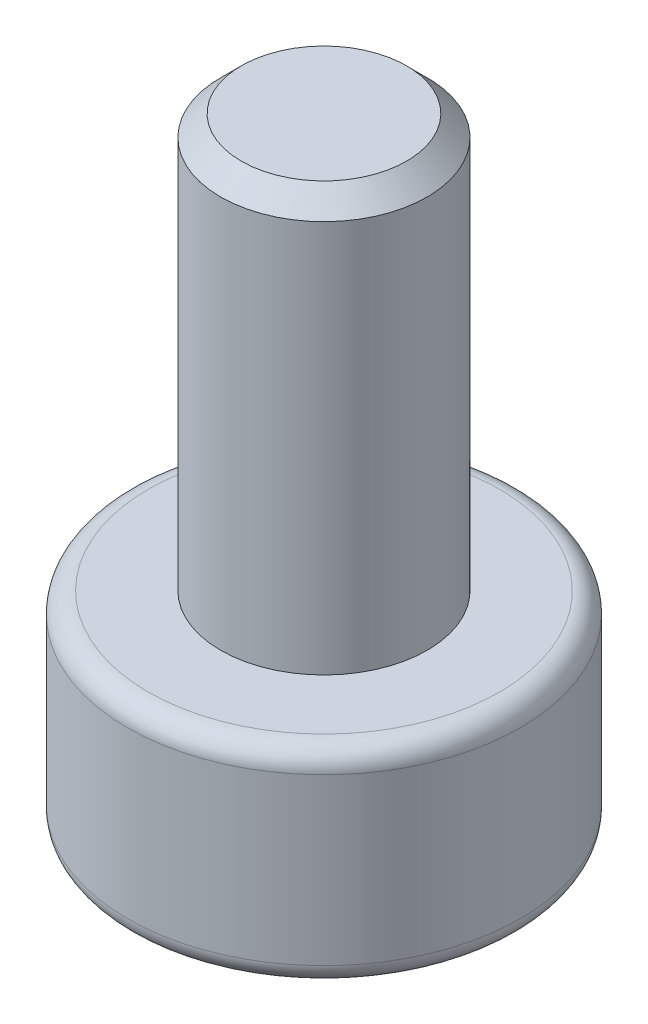
ISO-10303-21;
HEADER;
FILE_DESCRIPTION(('STEP AP214'),'2;1');
FILE_NAME('part.step','',(''),(''),'','','');
FILE_SCHEMA(('AUTOMOTIVE_DESIGN { 1 0 10303 214 1 1 1 1 }'));
ENDSEC;
DATA;
#1=APPLICATION_CONTEXT('core data for automotive mechanical design processes');
#2=APPLICATION_PROTOCOL_DEFINITION('international standard','automotive_design',2000,#1);
#3=PRODUCT_CONTEXT('',#1,'mechanical');
#4=PRODUCT('Part','Part','',(#3));
#5=PRODUCT_RELATED_PRODUCT_CATEGORY('part','',(#4));
#6=PRODUCT_DEFINITION_FORMATION('','',#4);
#7=PRODUCT_DEFINITION_CONTEXT('part definition',#1,'design');
#8=PRODUCT_DEFINITION('design','',#6,#7);
#9=PRODUCT_DEFINITION_SHAPE('','',#8);
#10=(LENGTH_UNIT() NAMED_UNIT(*) SI_UNIT(.MILLI.,.METRE.));
#11=(NAMED_UNIT(*) PLANE_ANGLE_UNIT() SI_UNIT($,.RADIAN.));
#12=(NAMED_UNIT(*) SI_UNIT($,.STERADIAN.) SOLID_ANGLE_UNIT());
#13=UNCERTAINTY_MEASURE_WITH_UNIT(LENGTH_MEASURE(1.E-05),#10,'distance_accuracy_value','');
#14=(GEOMETRIC_REPRESENTATION_CONTEXT(3) GLOBAL_UNCERTAINTY_ASSIGNED_CONTEXT((#13)) GLOBAL_UNIT_ASSIGNED_CONTEXT((#10,
#11,#12)) REPRESENTATION_CONTEXT('',''));
#15=CARTESIAN_POINT('',(0.,0.,0.));
#16=DIRECTION('',(0.,0.,1.));
#17=DIRECTION('',(1.,0.,0.));
#18=AXIS2_PLACEMENT_3D('',#15,#16,#17);
#19=CARTESIAN_POINT('',(0.,3.,0.));
#20=DIRECTION('',(0.,-1.,0.));
#21=DIRECTION('',(0.,0.,-1.));
#22=AXIS2_PLACEMENT_3D('',#19,#20,#21);
#23=CYLINDRICAL_SURFACE('',#22,2.85);
#24=CARTESIAN_POINT('',(0.,2.7,0.));
#25=DIRECTION('',(0.,1.,0.));
#26=DIRECTION('',(0.,0.,1.));
#27=AXIS2_PLACEMENT_3D('',#24,#25,#26);
#28=CIRCLE('',#27,2.85);
#29=CARTESIAN_POINT('',(0.,2.7,2.85));
#30=VERTEX_POINT('',#29);
#31=EDGE_CURVE('E68',#30,#30,#28,.F.);
#32=ORIENTED_EDGE('',*,*,#31,.T.);
#33=EDGE_LOOP('',(#32));
#34=FACE_BOUND('',#33,.T.);
#35=CARTESIAN_POINT('',(0.,0.3,0.));
#36=DIRECTION('',(0.,1.,0.));
#37=DIRECTION('',(0.,0.,1.));
#38=AXIS2_PLACEMENT_3D('',#35,#36,#37);
#39=CIRCLE('',#38,2.85);
#40=CARTESIAN_POINT('',(0.,0.3,2.85));
#41=VERTEX_POINT('',#40);
#42=EDGE_CURVE('E72',#41,#41,#39,.T.);
#43=ORIENTED_EDGE('',*,*,#42,.T.);
#44=EDGE_LOOP('',(#43));
#45=FACE_BOUND('',#44,.T.);
#46=ADVANCED_FACE('F39',(#34,#45),#23,.T.);
#47=CARTESIAN_POINT('',(0.,3.,0.));
#48=DIRECTION('',(0.,1.,0.));
#49=DIRECTION('',(0.,0.,1.));
#50=AXIS2_PLACEMENT_3D('',#47,#48,#49);
#51=PLANE('',#50);
#52=CARTESIAN_POINT('',(0.,3.,0.));
#53=DIRECTION('',(0.,1.,0.));
#54=DIRECTION('',(0.,0.,1.));
#55=AXIS2_PLACEMENT_3D('',#52,#53,#54);
#56=CIRCLE('',#55,2.55);
#57=CARTESIAN_POINT('',(0.,3.,2.55));
#58=VERTEX_POINT('',#57);
#59=EDGE_CURVE('E76',#58,#58,#56,.T.);
#60=ORIENTED_EDGE('',*,*,#59,.T.);
#61=EDGE_LOOP('',(#60));
#62=FACE_BOUND('',#61,.T.);
#63=CARTESIAN_POINT('',(0.,3.,0.));
#64=DIRECTION('',(0.,1.,0.));
#65=DIRECTION('',(0.,0.,1.));
#66=AXIS2_PLACEMENT_3D('',#63,#64,#65);
#67=CIRCLE('',#66,1.5);
#68=CARTESIAN_POINT('',(0.,3.,1.5));
#69=VERTEX_POINT('',#68);
#70=EDGE_CURVE('E80',#69,#69,#67,.T.);
#71=ORIENTED_EDGE('',*,*,#70,.F.);
#72=EDGE_LOOP('',(#71));
#73=FACE_BOUND('',#72,.T.);
#74=ADVANCED_FACE('F105',(#62,#73),#51,.T.);
#75=CARTESIAN_POINT('',(0.,0.,0.));
#76=DIRECTION('',(0.,1.,0.));
#77=DIRECTION('',(0.,0.,1.));
#78=AXIS2_PLACEMENT_3D('',#75,#76,#77);
#79=PLANE('',#78);
#80=CARTESIAN_POINT('',(0.,0.,0.));
#81=DIRECTION('',(0.,1.,0.));
#82=DIRECTION('',(0.,0.,1.));
#83=AXIS2_PLACEMENT_3D('',#80,#81,#82);
#84=CIRCLE('',#83,1.44);
#85=CARTESIAN_POINT('',(0.,0.,1.44));
#86=VERTEX_POINT('',#85);
#87=EDGE_CURVE('E10',#86,#86,#84,.T.);
#88=ORIENTED_EDGE('',*,*,#87,.T.);
#89=EDGE_LOOP('',(#88));
#90=FACE_BOUND('',#89,.T.);
#91=CARTESIAN_POINT('',(0.,0.,0.));
#92=DIRECTION('',(0.,1.,0.));
#93=DIRECTION('',(0.,0.,1.));
#94=AXIS2_PLACEMENT_3D('',#91,#92,#93);
#95=CIRCLE('',#94,2.55);
#96=CARTESIAN_POINT('',(0.,0.,2.55));
#97=VERTEX_POINT('',#96);
#98=EDGE_CURVE('E64',#97,#97,#95,.F.);
#99=ORIENTED_EDGE('',*,*,#98,.T.);
#100=EDGE_LOOP('',(#99));
#101=FACE_BOUND('',#100,.T.);
#102=ADVANCED_FACE('F111',(#90,#101),#79,.F.);
#103=CARTESIAN_POINT('',(0.,9.,0.));
#104=DIRECTION('',(0.,-1.,0.));
#105=DIRECTION('',(0.,0.,-1.));
#106=AXIS2_PLACEMENT_3D('',#103,#104,#105);
#107=CYLINDRICAL_SURFACE('',#106,1.5);
#108=CARTESIAN_POINT('',(0.,8.7,0.));
#109=DIRECTION('',(0.,1.,0.));
#110=DIRECTION('',(0.,0.,1.));
#111=AXIS2_PLACEMENT_3D('',#108,#109,#110);
#112=CIRCLE('',#111,1.5);
#113=CARTESIAN_POINT('',(0.,8.7,1.5));
#114=VERTEX_POINT('',#113);
#115=EDGE_CURVE('E53',#114,#114,#112,.F.);
#116=ORIENTED_EDGE('',*,*,#115,.T.);
#117=EDGE_LOOP('',(#116));
#118=FACE_BOUND('',#117,.T.);
#119=ORIENTED_EDGE('',*,*,#70,.T.);
#120=EDGE_LOOP('',(#119));
#121=FACE_BOUND('',#120,.T.);
#122=ADVANCED_FACE('F101',(#118,#121),#107,.T.);
#123=CARTESIAN_POINT('',(0.,9.,0.));
#124=DIRECTION('',(0.,1.,0.));
#125=DIRECTION('',(0.,0.,1.));
#126=AXIS2_PLACEMENT_3D('',#123,#124,#125);
#127=PLANE('',#126);
#128=CARTESIAN_POINT('',(0.,9.,0.));
#129=DIRECTION('',(0.,1.,0.));
#130=DIRECTION('',(0.,0.,1.));
#131=AXIS2_PLACEMENT_3D('',#128,#129,#130);
#132=CIRCLE('',#131,1.2);
#133=CARTESIAN_POINT('',(0.,9.,1.2));
#134=VERTEX_POINT('',#133);
#135=EDGE_CURVE('E58',#134,#134,#132,.T.);
#136=ORIENTED_EDGE('',*,*,#135,.T.);
#137=EDGE_LOOP('',(#136));
#138=FACE_BOUND('',#137,.T.);
#139=ADVANCED_FACE('F93',(#138),#127,.T.);
#140=CARTESIAN_POINT('',(0.,1.3,0.));
#141=DIRECTION('',(0.,-1.,0.));
#142=DIRECTION('',(0.,0.,-1.));
#143=AXIS2_PLACEMENT_3D('',#140,#141,#142);
#144=CYLINDRICAL_SURFACE('',#143,1.29);
#145=CARTESIAN_POINT('',(0.,0.15,0.));
#146=DIRECTION('',(0.,1.,0.));
#147=DIRECTION('',(0.,0.,1.));
#148=AXIS2_PLACEMENT_3D('',#145,#146,#147);
#149=CIRCLE('',#148,1.29);
#150=CARTESIAN_POINT('',(0.,0.15,1.29));
#151=VERTEX_POINT('',#150);
#152=EDGE_CURVE('E48',#151,#151,#149,.F.);
#153=ORIENTED_EDGE('',*,*,#152,.T.);
#154=EDGE_LOOP('',(#153));
#155=FACE_BOUND('',#154,.T.);
#156=CARTESIAN_POINT('',(0.,1.3,0.));
#157=DIRECTION('',(0.,-1.,0.));
#158=DIRECTION('',(0.,0.,-1.));
#159=AXIS2_PLACEMENT_3D('',#156,#157,#158);
#160=CIRCLE('',#159,1.29);
#161=CARTESIAN_POINT('',(0.,1.3,-1.29));
#162=VERTEX_POINT('',#161);
#163=EDGE_CURVE('E84',#162,#162,#160,.T.);
#164=ORIENTED_EDGE('',*,*,#163,.F.);
#165=EDGE_LOOP('',(#164));
#166=FACE_BOUND('',#165,.T.);
#167=ADVANCED_FACE('F91',(#155,#166),#144,.F.);
#168=CARTESIAN_POINT('',(0.,1.3,0.));
#169=DIRECTION('',(0.,-1.,0.));
#170=DIRECTION('',(0.,0.,-1.));
#171=AXIS2_PLACEMENT_3D('',#168,#169,#170);
#172=PLANE('',#171);
#173=ORIENTED_EDGE('',*,*,#163,.T.);
#174=EDGE_LOOP('',(#173));
#175=FACE_BOUND('',#174,.T.);
#176=ADVANCED_FACE('F89',(#175),#172,.T.);
#177=CARTESIAN_POINT('',(0.,2.7,0.));
#178=DIRECTION('',(0.,1.,0.));
#179=DIRECTION('',(0.,0.,1.));
#180=AXIS2_PLACEMENT_3D('',#177,#178,#179);
#181=TOROIDAL_SURFACE('',#180,2.55,0.3);
#182=ORIENTED_EDGE('',*,*,#31,.F.);
#183=EDGE_LOOP('',(#182));
#184=FACE_BOUND('',#183,.T.);
#185=ORIENTED_EDGE('',*,*,#59,.F.);
#186=EDGE_LOOP('',(#185));
#187=FACE_BOUND('',#186,.T.);
#188=ADVANCED_FACE('F99',(#184,#187),#181,.T.);
#189=CARTESIAN_POINT('',(0.,0.3,0.));
#190=DIRECTION('',(0.,1.,0.));
#191=DIRECTION('',(0.,0.,1.));
#192=AXIS2_PLACEMENT_3D('',#189,#190,#191);
#193=TOROIDAL_SURFACE('',#192,2.55,0.3);
#194=ORIENTED_EDGE('',*,*,#98,.F.);
#195=EDGE_LOOP('',(#194));
#196=FACE_BOUND('',#195,.T.);
#197=ORIENTED_EDGE('',*,*,#42,.F.);
#198=EDGE_LOOP('',(#197));
#199=FACE_BOUND('',#198,.T.);
#200=ADVANCED_FACE('F119',(#196,#199),#193,.T.);
#201=CARTESIAN_POINT('',(0.,9.,0.));
#202=DIRECTION('',(0.,-1.,0.));
#203=DIRECTION('',(0.,0.,-1.));
#204=AXIS2_PLACEMENT_3D('',#201,#202,#203);
#205=CONICAL_SURFACE('',#204,1.2,0.785398163397444);
#206=ORIENTED_EDGE('',*,*,#115,.F.);
#207=EDGE_LOOP('',(#206));
#208=FACE_BOUND('',#207,.T.);
#209=ORIENTED_EDGE('',*,*,#135,.F.);
#210=EDGE_LOOP('',(#209));
#211=FACE_BOUND('',#210,.T.);
#212=ADVANCED_FACE('F122',(#208,#211),#205,.T.);
#213=CARTESIAN_POINT('',(0.,0.15,0.));
#214=DIRECTION('',(0.,-1.,0.));
#215=DIRECTION('',(0.,0.,-1.));
#216=AXIS2_PLACEMENT_3D('',#213,#214,#215);
#217=CONICAL_SURFACE('',#216,1.29,0.78539816339745);
#218=ORIENTED_EDGE('',*,*,#87,.F.);
#219=EDGE_LOOP('',(#218));
#220=FACE_BOUND('',#219,.T.);
#221=ORIENTED_EDGE('',*,*,#152,.F.);
#222=EDGE_LOOP('',(#221));
#223=FACE_BOUND('',#222,.T.);
#224=ADVANCED_FACE('F42',(#220,#223),#217,.F.);
#225=CLOSED_SHELL('',(#46,#74,#102,#122,#139,#167,#176,#188,#200,#212,#224));
#226=MANIFOLD_SOLID_BREP('B2',#225);
#227=ADVANCED_BREP_SHAPE_REPRESENTATION('',(#18,#226),#14);
#228=SHAPE_DEFINITION_REPRESENTATION(#9,#227);
ENDSEC;
END-ISO-10303-21;
